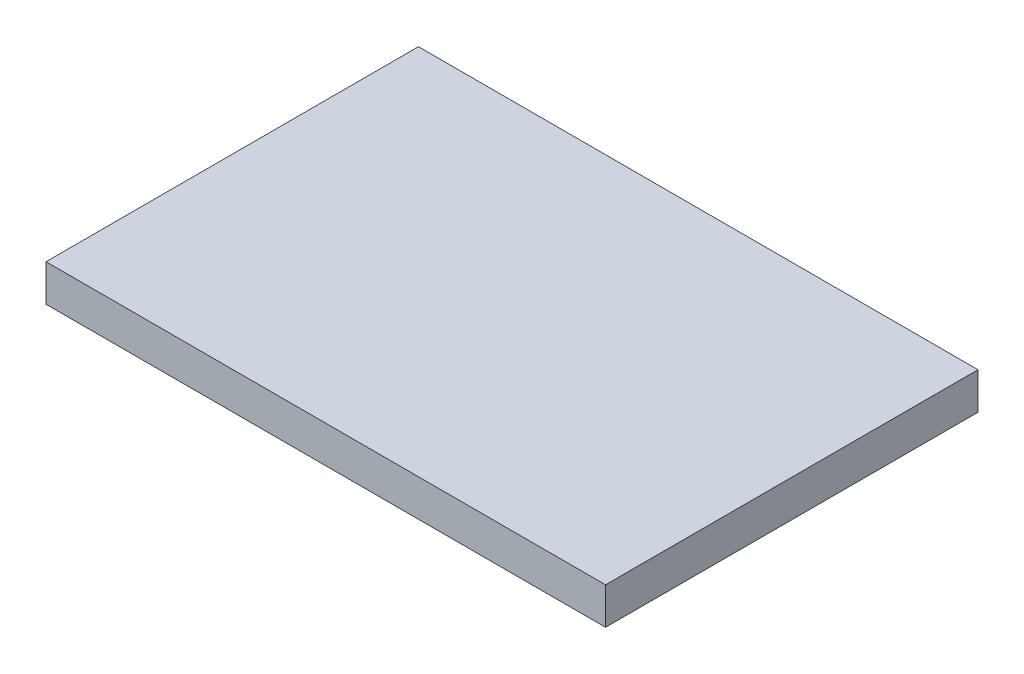
ISO-10303-21;
HEADER;
FILE_DESCRIPTION(('STEP AP214'),'2;1');
FILE_NAME('part.step','',(''),(''),'','','');
FILE_SCHEMA(('AUTOMOTIVE_DESIGN { 1 0 10303 214 1 1 1 1 }'));
ENDSEC;
DATA;
#1=APPLICATION_CONTEXT('core data for automotive mechanical design processes');
#2=APPLICATION_PROTOCOL_DEFINITION('international standard','automotive_design',2000,#1);
#3=PRODUCT_CONTEXT('',#1,'mechanical');
#4=PRODUCT('Part','Part','',(#3));
#5=PRODUCT_RELATED_PRODUCT_CATEGORY('part','',(#4));
#6=PRODUCT_DEFINITION_FORMATION('','',#4);
#7=PRODUCT_DEFINITION_CONTEXT('part definition',#1,'design');
#8=PRODUCT_DEFINITION('design','',#6,#7);
#9=PRODUCT_DEFINITION_SHAPE('','',#8);
#10=(LENGTH_UNIT() NAMED_UNIT(*) SI_UNIT(.MILLI.,.METRE.));
#11=(NAMED_UNIT(*) PLANE_ANGLE_UNIT() SI_UNIT($,.RADIAN.));
#12=(NAMED_UNIT(*) SI_UNIT($,.STERADIAN.) SOLID_ANGLE_UNIT());
#13=UNCERTAINTY_MEASURE_WITH_UNIT(LENGTH_MEASURE(1.E-05),#10,'distance_accuracy_value','');
#14=(GEOMETRIC_REPRESENTATION_CONTEXT(3) GLOBAL_UNCERTAINTY_ASSIGNED_CONTEXT((#13)) GLOBAL_UNIT_ASSIGNED_CONTEXT((#10,
#11,#12)) REPRESENTATION_CONTEXT('',''));
#15=CARTESIAN_POINT('',(0.,0.,0.));
#16=DIRECTION('',(0.,0.,1.));
#17=DIRECTION('',(1.,0.,0.));
#18=AXIS2_PLACEMENT_3D('',#15,#16,#17);
#19=CARTESIAN_POINT('',(23.925,-3.15,-15.925));
#20=DIRECTION('',(1.,0.,0.));
#21=DIRECTION('',(0.,0.,-1.));
#22=AXIS2_PLACEMENT_3D('',#19,#20,#21);
#23=PLANE('',#22);
#24=DIRECTION('',(0.,0.,-1.));
#25=VECTOR('',#24,1.);
#26=CARTESIAN_POINT('',(23.925,0.,-15.925));
#27=LINE('',#26,#25);
#28=CARTESIAN_POINT('',(23.925,0.,15.925));
#29=VERTEX_POINT('',#28);
#30=CARTESIAN_POINT('',(23.925,0.,-15.925));
#31=VERTEX_POINT('',#30);
#32=EDGE_CURVE('E115',#29,#31,#27,.T.);
#33=ORIENTED_EDGE('',*,*,#32,.F.);
#34=DIRECTION('',(0.,1.,0.));
#35=VECTOR('',#34,1.);
#36=CARTESIAN_POINT('',(23.925,-3.15,15.925));
#37=LINE('',#36,#35);
#38=CARTESIAN_POINT('',(23.925,-3.15,15.925));
#39=VERTEX_POINT('',#38);
#40=EDGE_CURVE('E11',#39,#29,#37,.T.);
#41=ORIENTED_EDGE('',*,*,#40,.F.);
#42=DIRECTION('',(0.,0.,-1.));
#43=VECTOR('',#42,1.);
#44=CARTESIAN_POINT('',(23.925,-3.15,-15.925));
#45=LINE('',#44,#43);
#46=CARTESIAN_POINT('',(23.925,-3.15,-15.925));
#47=VERTEX_POINT('',#46);
#48=EDGE_CURVE('E146',#39,#47,#45,.T.);
#49=ORIENTED_EDGE('',*,*,#48,.T.);
#50=DIRECTION('',(0.,1.,0.));
#51=VECTOR('',#50,1.);
#52=CARTESIAN_POINT('',(23.925,-3.15,-15.925));
#53=LINE('',#52,#51);
#54=EDGE_CURVE('E36',#47,#31,#53,.T.);
#55=ORIENTED_EDGE('',*,*,#54,.T.);
#56=EDGE_LOOP('',(#33,#41,#49,#55));
#57=FACE_BOUND('',#56,.T.);
#58=ADVANCED_FACE('F33',(#57),#23,.T.);
#59=CARTESIAN_POINT('',(-23.925,-3.15,15.925));
#60=DIRECTION('',(0.,0.,1.));
#61=DIRECTION('',(1.,0.,0.));
#62=AXIS2_PLACEMENT_3D('',#59,#60,#61);
#63=PLANE('',#62);
#64=DIRECTION('',(1.,0.,0.));
#65=VECTOR('',#64,1.);
#66=CARTESIAN_POINT('',(-23.925,0.,15.925));
#67=LINE('',#66,#65);
#68=CARTESIAN_POINT('',(-23.925,0.,15.925));
#69=VERTEX_POINT('',#68);
#70=EDGE_CURVE('E149',#69,#29,#67,.T.);
#71=ORIENTED_EDGE('',*,*,#70,.F.);
#72=DIRECTION('',(0.,1.,0.));
#73=VECTOR('',#72,1.);
#74=CARTESIAN_POINT('',(-23.925,-3.15,15.925));
#75=LINE('',#74,#73);
#76=CARTESIAN_POINT('',(-23.925,-3.15,15.925));
#77=VERTEX_POINT('',#76);
#78=EDGE_CURVE('E41',#77,#69,#75,.T.);
#79=ORIENTED_EDGE('',*,*,#78,.F.);
#80=DIRECTION('',(1.,0.,0.));
#81=VECTOR('',#80,1.);
#82=CARTESIAN_POINT('',(-23.925,-3.15,15.925));
#83=LINE('',#82,#81);
#84=EDGE_CURVE('E154',#77,#39,#83,.T.);
#85=ORIENTED_EDGE('',*,*,#84,.T.);
#86=ORIENTED_EDGE('',*,*,#40,.T.);
#87=EDGE_LOOP('',(#71,#79,#85,#86));
#88=FACE_BOUND('',#87,.T.);
#89=ADVANCED_FACE('F171',(#88),#63,.T.);
#90=CARTESIAN_POINT('',(-23.925,-3.15,-15.925));
#91=DIRECTION('',(-1.,0.,0.));
#92=DIRECTION('',(0.,0.,1.));
#93=AXIS2_PLACEMENT_3D('',#90,#91,#92);
#94=PLANE('',#93);
#95=DIRECTION('',(0.,0.,1.));
#96=VECTOR('',#95,1.);
#97=CARTESIAN_POINT('',(-23.925,0.,-15.925));
#98=LINE('',#97,#96);
#99=CARTESIAN_POINT('',(-23.925,0.,-15.925));
#100=VERTEX_POINT('',#99);
#101=EDGE_CURVE('E161',#100,#69,#98,.T.);
#102=ORIENTED_EDGE('',*,*,#101,.F.);
#103=DIRECTION('',(0.,1.,0.));
#104=VECTOR('',#103,1.);
#105=CARTESIAN_POINT('',(-23.925,-3.15,-15.925));
#106=LINE('',#105,#104);
#107=CARTESIAN_POINT('',(-23.925,-3.15,-15.925));
#108=VERTEX_POINT('',#107);
#109=EDGE_CURVE('E166',#108,#100,#106,.T.);
#110=ORIENTED_EDGE('',*,*,#109,.F.);
#111=DIRECTION('',(0.,0.,1.));
#112=VECTOR('',#111,1.);
#113=CARTESIAN_POINT('',(-23.925,-3.15,-15.925));
#114=LINE('',#113,#112);
#115=EDGE_CURVE('E151',#108,#77,#114,.T.);
#116=ORIENTED_EDGE('',*,*,#115,.T.);
#117=ORIENTED_EDGE('',*,*,#78,.T.);
#118=EDGE_LOOP('',(#102,#110,#116,#117));
#119=FACE_BOUND('',#118,.T.);
#120=ADVANCED_FACE('F175',(#119),#94,.T.);
#121=CARTESIAN_POINT('',(-23.925,-3.15,-15.925));
#122=DIRECTION('',(0.,0.,-1.));
#123=DIRECTION('',(-1.,0.,0.));
#124=AXIS2_PLACEMENT_3D('',#121,#122,#123);
#125=PLANE('',#124);
#126=DIRECTION('',(-1.,0.,0.));
#127=VECTOR('',#126,1.);
#128=CARTESIAN_POINT('',(-23.925,0.,-15.925));
#129=LINE('',#128,#127);
#130=EDGE_CURVE('E158',#31,#100,#129,.T.);
#131=ORIENTED_EDGE('',*,*,#130,.F.);
#132=ORIENTED_EDGE('',*,*,#54,.F.);
#133=DIRECTION('',(-1.,0.,0.));
#134=VECTOR('',#133,1.);
#135=CARTESIAN_POINT('',(-23.925,-3.15,-15.925));
#136=LINE('',#135,#134);
#137=EDGE_CURVE('E148',#47,#108,#136,.T.);
#138=ORIENTED_EDGE('',*,*,#137,.T.);
#139=ORIENTED_EDGE('',*,*,#109,.T.);
#140=EDGE_LOOP('',(#131,#132,#138,#139));
#141=FACE_BOUND('',#140,.T.);
#142=ADVANCED_FACE('F168',(#141),#125,.T.);
#143=CARTESIAN_POINT('',(0.,-3.15,0.));
#144=DIRECTION('',(0.,1.,0.));
#145=DIRECTION('',(0.,0.,1.));
#146=AXIS2_PLACEMENT_3D('',#143,#144,#145);
#147=PLANE('',#146);
#148=DIRECTION('',(1.,0.,0.));
#149=VECTOR('',#148,1.);
#150=CARTESIAN_POINT('',(0.,-3.15,14.425));
#151=LINE('',#150,#149);
#152=CARTESIAN_POINT('',(-22.425,-3.15,14.425));
#153=VERTEX_POINT('',#152);
#154=CARTESIAN_POINT('',(22.425,-3.15,14.425));
#155=VERTEX_POINT('',#154);
#156=EDGE_CURVE('E141',#153,#155,#151,.T.);
#157=ORIENTED_EDGE('',*,*,#156,.T.);
#158=DIRECTION('',(0.,0.,-1.));
#159=VECTOR('',#158,1.);
#160=CARTESIAN_POINT('',(22.425,-3.15,0.));
#161=LINE('',#160,#159);
#162=CARTESIAN_POINT('',(22.425,-3.15,-14.425));
#163=VERTEX_POINT('',#162);
#164=EDGE_CURVE('E110',#155,#163,#161,.T.);
#165=ORIENTED_EDGE('',*,*,#164,.T.);
#166=DIRECTION('',(-1.,0.,0.));
#167=VECTOR('',#166,1.);
#168=CARTESIAN_POINT('',(0.,-3.15,-14.425));
#169=LINE('',#168,#167);
#170=CARTESIAN_POINT('',(-22.425,-3.15,-14.425));
#171=VERTEX_POINT('',#170);
#172=EDGE_CURVE('E131',#163,#171,#169,.T.);
#173=ORIENTED_EDGE('',*,*,#172,.T.);
#174=DIRECTION('',(0.,0.,1.));
#175=VECTOR('',#174,1.);
#176=CARTESIAN_POINT('',(-22.425,-3.15,0.));
#177=LINE('',#176,#175);
#178=EDGE_CURVE('E49',#171,#153,#177,.T.);
#179=ORIENTED_EDGE('',*,*,#178,.T.);
#180=EDGE_LOOP('',(#157,#165,#173,#179));
#181=FACE_BOUND('',#180,.T.);
#182=ORIENTED_EDGE('',*,*,#48,.F.);
#183=ORIENTED_EDGE('',*,*,#84,.F.);
#184=ORIENTED_EDGE('',*,*,#115,.F.);
#185=ORIENTED_EDGE('',*,*,#137,.F.);
#186=EDGE_LOOP('',(#182,#183,#184,#185));
#187=FACE_BOUND('',#186,.T.);
#188=ADVANCED_FACE('F177',(#181,#187),#147,.F.);
#189=CARTESIAN_POINT('',(0.,0.,0.));
#190=DIRECTION('',(0.,1.,0.));
#191=DIRECTION('',(0.,0.,1.));
#192=AXIS2_PLACEMENT_3D('',#189,#190,#191);
#193=PLANE('',#192);
#194=ORIENTED_EDGE('',*,*,#32,.T.);
#195=ORIENTED_EDGE('',*,*,#130,.T.);
#196=ORIENTED_EDGE('',*,*,#101,.T.);
#197=ORIENTED_EDGE('',*,*,#70,.T.);
#198=EDGE_LOOP('',(#194,#195,#196,#197));
#199=FACE_BOUND('',#198,.T.);
#200=ADVANCED_FACE('F170',(#199),#193,.T.);
#201=CARTESIAN_POINT('',(22.425,-3.15,-15.925));
#202=DIRECTION('',(1.,0.,0.));
#203=DIRECTION('',(0.,0.,-1.));
#204=AXIS2_PLACEMENT_3D('',#201,#202,#203);
#205=PLANE('',#204);
#206=DIRECTION('',(0.,0.,-1.));
#207=VECTOR('',#206,1.);
#208=CARTESIAN_POINT('',(22.425,-1.5,0.));
#209=LINE('',#208,#207);
#210=CARTESIAN_POINT('',(22.425,-1.5,14.425));
#211=VERTEX_POINT('',#210);
#212=CARTESIAN_POINT('',(22.425,-1.5,-14.425));
#213=VERTEX_POINT('',#212);
#214=EDGE_CURVE('E108',#211,#213,#209,.T.);
#215=ORIENTED_EDGE('',*,*,#214,.T.);
#216=DIRECTION('',(0.,1.,0.));
#217=VECTOR('',#216,1.);
#218=CARTESIAN_POINT('',(22.425,-3.15,-14.425));
#219=LINE('',#218,#217);
#220=EDGE_CURVE('E136',#163,#213,#219,.T.);
#221=ORIENTED_EDGE('',*,*,#220,.F.);
#222=ORIENTED_EDGE('',*,*,#164,.F.);
#223=DIRECTION('',(0.,1.,0.));
#224=VECTOR('',#223,1.);
#225=CARTESIAN_POINT('',(22.425,-3.15,14.425));
#226=LINE('',#225,#224);
#227=EDGE_CURVE('E105',#155,#211,#226,.T.);
#228=ORIENTED_EDGE('',*,*,#227,.T.);
#229=EDGE_LOOP('',(#215,#221,#222,#228));
#230=FACE_BOUND('',#229,.T.);
#231=ADVANCED_FACE('F107',(#230),#205,.F.);
#232=CARTESIAN_POINT('',(-23.925,-3.15,14.425));
#233=DIRECTION('',(0.,0.,1.));
#234=DIRECTION('',(1.,0.,0.));
#235=AXIS2_PLACEMENT_3D('',#232,#233,#234);
#236=PLANE('',#235);
#237=DIRECTION('',(1.,0.,0.));
#238=VECTOR('',#237,1.);
#239=CARTESIAN_POINT('',(0.,-1.5,14.425));
#240=LINE('',#239,#238);
#241=CARTESIAN_POINT('',(-22.425,-1.5,14.425));
#242=VERTEX_POINT('',#241);
#243=EDGE_CURVE('E123',#242,#211,#240,.T.);
#244=ORIENTED_EDGE('',*,*,#243,.T.);
#245=ORIENTED_EDGE('',*,*,#227,.F.);
#246=ORIENTED_EDGE('',*,*,#156,.F.);
#247=DIRECTION('',(0.,1.,0.));
#248=VECTOR('',#247,1.);
#249=CARTESIAN_POINT('',(-22.425,-3.15,14.425));
#250=LINE('',#249,#248);
#251=EDGE_CURVE('E116',#153,#242,#250,.T.);
#252=ORIENTED_EDGE('',*,*,#251,.T.);
#253=EDGE_LOOP('',(#244,#245,#246,#252));
#254=FACE_BOUND('',#253,.T.);
#255=ADVANCED_FACE('F127',(#254),#236,.F.);
#256=CARTESIAN_POINT('',(-22.425,-3.15,-15.925));
#257=DIRECTION('',(-1.,0.,0.));
#258=DIRECTION('',(0.,0.,1.));
#259=AXIS2_PLACEMENT_3D('',#256,#257,#258);
#260=PLANE('',#259);
#261=DIRECTION('',(0.,0.,1.));
#262=VECTOR('',#261,1.);
#263=CARTESIAN_POINT('',(-22.425,-1.5,0.));
#264=LINE('',#263,#262);
#265=CARTESIAN_POINT('',(-22.425,-1.5,-14.425));
#266=VERTEX_POINT('',#265);
#267=EDGE_CURVE('E129',#266,#242,#264,.T.);
#268=ORIENTED_EDGE('',*,*,#267,.T.);
#269=ORIENTED_EDGE('',*,*,#251,.F.);
#270=ORIENTED_EDGE('',*,*,#178,.F.);
#271=DIRECTION('',(0.,1.,0.));
#272=VECTOR('',#271,1.);
#273=CARTESIAN_POINT('',(-22.425,-3.15,-14.425));
#274=LINE('',#273,#272);
#275=EDGE_CURVE('E137',#171,#266,#274,.T.);
#276=ORIENTED_EDGE('',*,*,#275,.T.);
#277=EDGE_LOOP('',(#268,#269,#270,#276));
#278=FACE_BOUND('',#277,.T.);
#279=ADVANCED_FACE('F229',(#278),#260,.F.);
#280=CARTESIAN_POINT('',(-23.925,-3.15,-14.425));
#281=DIRECTION('',(0.,0.,-1.));
#282=DIRECTION('',(-1.,0.,0.));
#283=AXIS2_PLACEMENT_3D('',#280,#281,#282);
#284=PLANE('',#283);
#285=DIRECTION('',(-1.,0.,0.));
#286=VECTOR('',#285,1.);
#287=CARTESIAN_POINT('',(0.,-1.5,-14.425));
#288=LINE('',#287,#286);
#289=EDGE_CURVE('E125',#213,#266,#288,.T.);
#290=ORIENTED_EDGE('',*,*,#289,.T.);
#291=ORIENTED_EDGE('',*,*,#275,.F.);
#292=ORIENTED_EDGE('',*,*,#172,.F.);
#293=ORIENTED_EDGE('',*,*,#220,.T.);
#294=EDGE_LOOP('',(#290,#291,#292,#293));
#295=FACE_BOUND('',#294,.T.);
#296=ADVANCED_FACE('F238',(#295),#284,.F.);
#297=CARTESIAN_POINT('',(0.,-1.5,0.));
#298=DIRECTION('',(0.,1.,0.));
#299=DIRECTION('',(0.,0.,1.));
#300=AXIS2_PLACEMENT_3D('',#297,#298,#299);
#301=PLANE('',#300);
#302=ORIENTED_EDGE('',*,*,#214,.F.);
#303=ORIENTED_EDGE('',*,*,#243,.F.);
#304=ORIENTED_EDGE('',*,*,#267,.F.);
#305=ORIENTED_EDGE('',*,*,#289,.F.);
#306=EDGE_LOOP('',(#302,#303,#304,#305));
#307=FACE_BOUND('',#306,.T.);
#308=ADVANCED_FACE('F121',(#307),#301,.F.);
#309=CLOSED_SHELL('',(#58,#89,#120,#142,#188,#200,#231,#255,#279,#296,#308));
#310=MANIFOLD_SOLID_BREP('B2',#309);
#311=ADVANCED_BREP_SHAPE_REPRESENTATION('',(#18,#310),#14);
#312=SHAPE_DEFINITION_REPRESENTATION(#9,#311);
ENDSEC;
END-ISO-10303-21;
